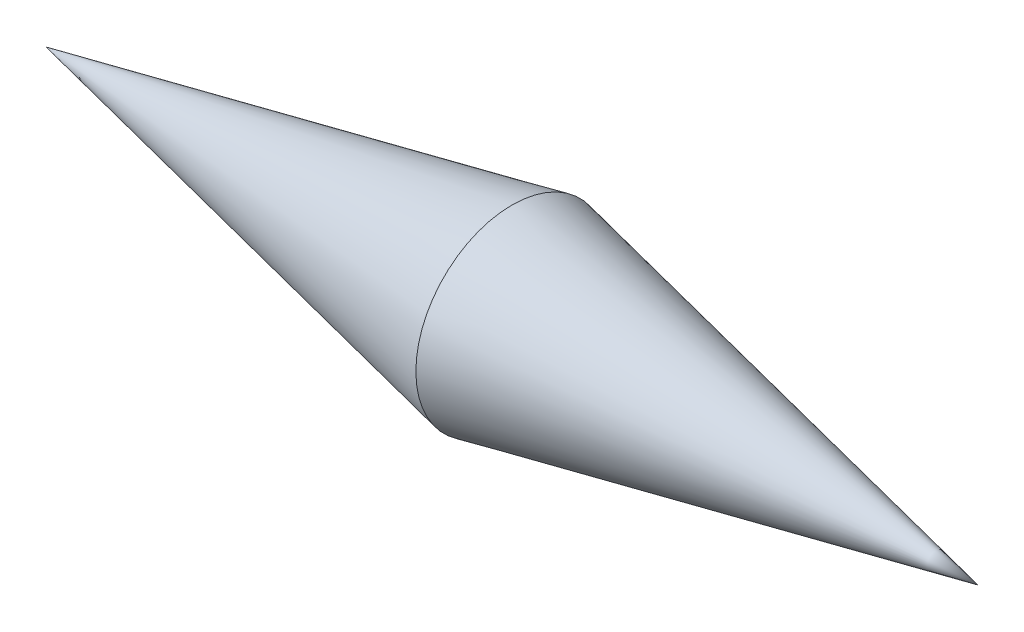
ISO-10303-21;
HEADER;
FILE_DESCRIPTION(('STEP AP214'),'2;1');
FILE_NAME('part.step','',(''),(''),'','','');
FILE_SCHEMA(('AUTOMOTIVE_DESIGN { 1 0 10303 214 1 1 1 1 }'));
ENDSEC;
DATA;
#1=APPLICATION_CONTEXT('core data for automotive mechanical design processes');
#2=APPLICATION_PROTOCOL_DEFINITION('international standard','automotive_design',2000,#1);
#3=PRODUCT_CONTEXT('',#1,'mechanical');
#4=PRODUCT('Part','Part','',(#3));
#5=PRODUCT_RELATED_PRODUCT_CATEGORY('part','',(#4));
#6=PRODUCT_DEFINITION_FORMATION('','',#4);
#7=PRODUCT_DEFINITION_CONTEXT('part definition',#1,'design');
#8=PRODUCT_DEFINITION('design','',#6,#7);
#9=PRODUCT_DEFINITION_SHAPE('','',#8);
#10=(LENGTH_UNIT() NAMED_UNIT(*) SI_UNIT(.MILLI.,.METRE.));
#11=(NAMED_UNIT(*) PLANE_ANGLE_UNIT() SI_UNIT($,.RADIAN.));
#12=(NAMED_UNIT(*) SI_UNIT($,.STERADIAN.) SOLID_ANGLE_UNIT());
#13=UNCERTAINTY_MEASURE_WITH_UNIT(LENGTH_MEASURE(1.E-05),#10,'distance_accuracy_value','');
#14=(GEOMETRIC_REPRESENTATION_CONTEXT(3) GLOBAL_UNCERTAINTY_ASSIGNED_CONTEXT((#13)) GLOBAL_UNIT_ASSIGNED_CONTEXT((#10,
#11,#12)) REPRESENTATION_CONTEXT('',''));
#15=CARTESIAN_POINT('',(0.,0.,0.));
#16=DIRECTION('',(0.,0.,1.));
#17=DIRECTION('',(1.,0.,0.));
#18=AXIS2_PLACEMENT_3D('',#15,#16,#17);
#19=CARTESIAN_POINT('',(3.078034611,0.,0.));
#20=DIRECTION('',(1.,0.,0.));
#21=DIRECTION('',(0.,1.,0.));
#22=AXIS2_PLACEMENT_3D('',#19,#20,#21);
#23=CONICAL_SURFACE('',#22,0.635,0.203446302972287);
#24=CARTESIAN_POINT('',(0.,0.,0.));
#25=VERTEX_POINT('',#24);
#26=VERTEX_LOOP('',#25);
#27=FACE_BOUND('',#26,.T.);
#28=CARTESIAN_POINT('',(3.078034611,0.,0.));
#29=DIRECTION('',(1.,0.,0.));
#30=DIRECTION('',(0.,1.,0.));
#31=AXIS2_PLACEMENT_3D('',#28,#29,#30);
#32=CIRCLE('',#31,0.635);
#33=CARTESIAN_POINT('',(3.078034611,0.635,0.));
#34=VERTEX_POINT('',#33);
#35=EDGE_CURVE('E11',#34,#34,#32,.T.);
#36=ORIENTED_EDGE('',*,*,#35,.F.);
#37=EDGE_LOOP('',(#36));
#38=FACE_BOUND('',#37,.T.);
#39=ADVANCED_FACE('F35',(#27,#38),#23,.T.);
#40=CARTESIAN_POINT('',(6.156069222,0.,0.));
#41=DIRECTION('',(-1.,0.,0.));
#42=DIRECTION('',(0.,-1.,0.));
#43=AXIS2_PLACEMENT_3D('',#40,#41,#42);
#44=CONICAL_SURFACE('',#43,0.,0.203446302972287);
#45=ORIENTED_EDGE('',*,*,#35,.T.);
#46=EDGE_LOOP('',(#45));
#47=FACE_BOUND('',#46,.T.);
#48=CARTESIAN_POINT('',(6.156069222,0.,0.));
#49=VERTEX_POINT('',#48);
#50=VERTEX_LOOP('',#49);
#51=FACE_BOUND('',#50,.T.);
#52=ADVANCED_FACE('F46',(#47,#51),#44,.T.);
#53=CLOSED_SHELL('',(#39,#52));
#54=MANIFOLD_SOLID_BREP('B2',#53);
#55=ADVANCED_BREP_SHAPE_REPRESENTATION('',(#18,#54),#14);
#56=SHAPE_DEFINITION_REPRESENTATION(#9,#55);
ENDSEC;
END-ISO-10303-21;
